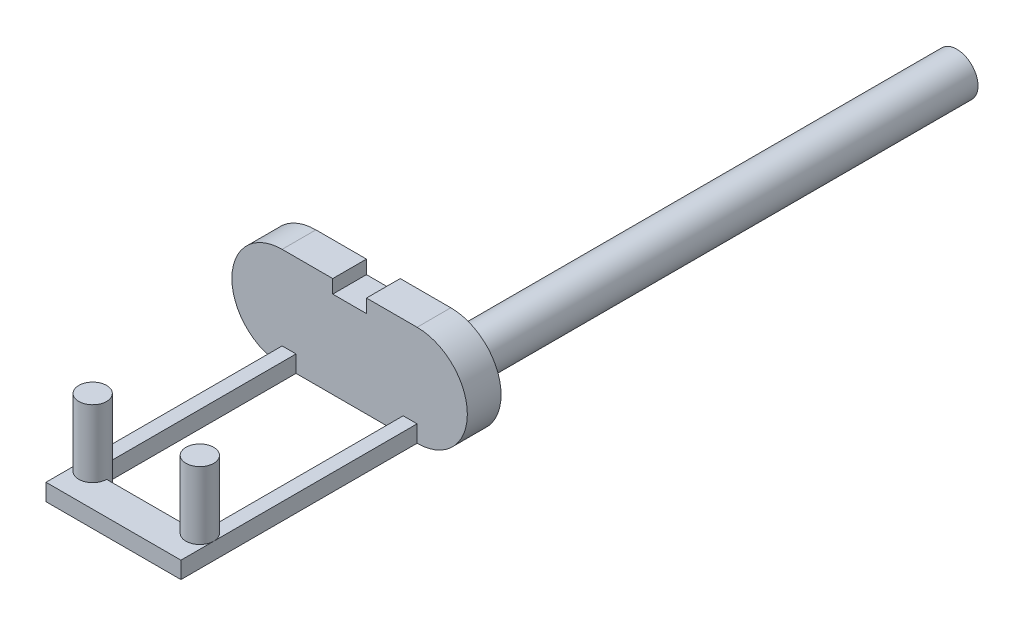
ISO-10303-21;
HEADER;
FILE_DESCRIPTION(('STEP AP214'),'2;1');
FILE_NAME('part.step','',(''),(''),'','','');
FILE_SCHEMA(('AUTOMOTIVE_DESIGN { 1 0 10303 214 1 1 1 1 }'));
ENDSEC;
DATA;
#1=APPLICATION_CONTEXT('core data for automotive mechanical design processes');
#2=APPLICATION_PROTOCOL_DEFINITION('international standard','automotive_design',2000,#1);
#3=PRODUCT_CONTEXT('',#1,'mechanical');
#4=PRODUCT('Part','Part','',(#3));
#5=PRODUCT_RELATED_PRODUCT_CATEGORY('part','',(#4));
#6=PRODUCT_DEFINITION_FORMATION('','',#4);
#7=PRODUCT_DEFINITION_CONTEXT('part definition',#1,'design');
#8=PRODUCT_DEFINITION('design','',#6,#7);
#9=PRODUCT_DEFINITION_SHAPE('','',#8);
#10=(LENGTH_UNIT() NAMED_UNIT(*) SI_UNIT(.MILLI.,.METRE.));
#11=(NAMED_UNIT(*) PLANE_ANGLE_UNIT() SI_UNIT($,.RADIAN.));
#12=(NAMED_UNIT(*) SI_UNIT($,.STERADIAN.) SOLID_ANGLE_UNIT());
#13=UNCERTAINTY_MEASURE_WITH_UNIT(LENGTH_MEASURE(1.E-05),#10,'distance_accuracy_value','');
#14=(GEOMETRIC_REPRESENTATION_CONTEXT(3) GLOBAL_UNCERTAINTY_ASSIGNED_CONTEXT((#13)) GLOBAL_UNIT_ASSIGNED_CONTEXT((#10,
#11,#12)) REPRESENTATION_CONTEXT('',''));
#15=CARTESIAN_POINT('',(0.,0.,0.));
#16=DIRECTION('',(0.,0.,1.));
#17=DIRECTION('',(1.,0.,0.));
#18=AXIS2_PLACEMENT_3D('',#15,#16,#17);
#19=CARTESIAN_POINT('',(-61.2640274636036,57.8352530805438,43.));
#20=DIRECTION('',(0.,-1.,0.));
#21=DIRECTION('',(0.,0.,-1.));
#22=AXIS2_PLACEMENT_3D('',#19,#20,#21);
#23=PLANE('',#22);
#24=DIRECTION('',(-1.,0.,0.));
#25=VECTOR('',#24,1.);
#26=CARTESIAN_POINT('',(-61.2640274636036,57.8352530805438,43.));
#27=LINE('',#26,#25);
#28=CARTESIAN_POINT('',(-73.7640274636036,57.8352530805438,43.));
#29=VERTEX_POINT('',#28);
#30=CARTESIAN_POINT('',(-81.2640274636036,57.8352530805438,43.));
#31=VERTEX_POINT('',#30);
#32=EDGE_CURVE('E154',#29,#31,#27,.T.);
#33=ORIENTED_EDGE('',*,*,#32,.F.);
#34=DIRECTION('',(0.,0.,1.));
#35=VECTOR('',#34,1.);
#36=CARTESIAN_POINT('',(-73.7640274636036,57.8352530805438,30.3857382714521));
#37=LINE('',#36,#35);
#38=CARTESIAN_POINT('',(-73.7640274636036,57.8352530805438,38.));
#39=VERTEX_POINT('',#38);
#40=EDGE_CURVE('E142',#39,#29,#37,.T.);
#41=ORIENTED_EDGE('',*,*,#40,.F.);
#42=DIRECTION('',(-1.,0.,0.));
#43=VECTOR('',#42,1.);
#44=CARTESIAN_POINT('',(-61.2640274636036,57.8352530805438,38.));
#45=LINE('',#44,#43);
#46=CARTESIAN_POINT('',(-81.2640274636036,57.8352530805438,38.));
#47=VERTEX_POINT('',#46);
#48=EDGE_CURVE('E152',#39,#47,#45,.T.);
#49=ORIENTED_EDGE('',*,*,#48,.T.);
#50=DIRECTION('',(0.,0.,-1.));
#51=VECTOR('',#50,1.);
#52=CARTESIAN_POINT('',(-81.2640274636036,57.8352530805438,43.));
#53=LINE('',#52,#51);
#54=EDGE_CURVE('E182',#31,#47,#53,.T.);
#55=ORIENTED_EDGE('',*,*,#54,.F.);
#56=EDGE_LOOP('',(#33,#41,#49,#55));
#57=FACE_BOUND('',#56,.T.);
#58=ADVANCED_FACE('F16',(#57),#23,.F.);
#59=CARTESIAN_POINT('',(0.,45.4390579258131,78.));
#60=DIRECTION('',(0.,1.,0.));
#61=DIRECTION('',(0.,0.,1.));
#62=AXIS2_PLACEMENT_3D('',#59,#60,#61);
#63=PLANE('',#62);
#64=CARTESIAN_POINT('',(-79.2048370431136,45.4390579258131,73.1394620866765));
#65=DIRECTION('',(0.,1.,0.));
#66=DIRECTION('',(0.,0.,1.));
#67=AXIS2_PLACEMENT_3D('',#64,#65,#66);
#68=CIRCLE('',#67,2.0591905457382);
#69=CARTESIAN_POINT('',(-79.2048370431136,45.4390579258131,71.0802715409383));
#70=VERTEX_POINT('',#69);
#71=CARTESIAN_POINT('',(-81.2640275888518,45.4390579258131,73.1394620866765));
#72=VERTEX_POINT('',#71);
#73=EDGE_CURVE('E314',#70,#72,#68,.T.);
#74=ORIENTED_EDGE('',*,*,#73,.F.);
#75=DIRECTION('',(0.,0.,-1.));
#76=VECTOR('',#75,1.);
#77=CARTESIAN_POINT('',(-79.2048370431136,45.4390579258131,78.));
#78=LINE('',#77,#76);
#79=CARTESIAN_POINT('',(-79.2048370431136,45.4390579258131,43.));
#80=VERTEX_POINT('',#79);
#81=EDGE_CURVE('E247',#70,#80,#78,.T.);
#82=ORIENTED_EDGE('',*,*,#81,.T.);
#83=DIRECTION('',(1.,0.,0.));
#84=VECTOR('',#83,1.);
#85=CARTESIAN_POINT('',(0.,45.4390579258131,43.));
#86=LINE('',#85,#84);
#87=CARTESIAN_POINT('',(-81.2640275888518,45.4390579258131,43.));
#88=VERTEX_POINT('',#87);
#89=EDGE_CURVE('E237',#88,#80,#86,.T.);
#90=ORIENTED_EDGE('',*,*,#89,.F.);
#91=DIRECTION('',(0.,0.,-1.));
#92=VECTOR('',#91,1.);
#93=CARTESIAN_POINT('',(-81.2640275888518,45.4390579258131,78.));
#94=LINE('',#93,#92);
#95=EDGE_CURVE('E232',#72,#88,#94,.T.);
#96=ORIENTED_EDGE('',*,*,#95,.F.);
#97=EDGE_LOOP('',(#74,#82,#90,#96));
#98=FACE_BOUND('',#97,.T.);
#99=ADVANCED_FACE('F318',(#98),#63,.T.);
#100=CARTESIAN_POINT('',(-63.3232178840935,45.4390579258131,73.1394620866765));
#101=DIRECTION('',(0.,1.,0.));
#102=DIRECTION('',(0.,0.,1.));
#103=AXIS2_PLACEMENT_3D('',#100,#101,#102);
#104=CIRCLE('',#103,2.05919054573816);
#105=CARTESIAN_POINT('',(-61.2640273383553,45.4390579258131,73.1394620866765));
#106=VERTEX_POINT('',#105);
#107=CARTESIAN_POINT('',(-63.3232178840935,45.4390579258131,71.0802715409384));
#108=VERTEX_POINT('',#107);
#109=EDGE_CURVE('E294',#106,#108,#104,.T.);
#110=ORIENTED_EDGE('',*,*,#109,.F.);
#111=DIRECTION('',(0.,0.,-1.));
#112=VECTOR('',#111,1.);
#113=CARTESIAN_POINT('',(-61.2640273383553,45.4390579258131,78.));
#114=LINE('',#113,#112);
#115=CARTESIAN_POINT('',(-61.2640273383553,45.4390579258131,43.));
#116=VERTEX_POINT('',#115);
#117=EDGE_CURVE('E269',#106,#116,#114,.T.);
#118=ORIENTED_EDGE('',*,*,#117,.T.);
#119=DIRECTION('',(1.,0.,0.));
#120=VECTOR('',#119,1.);
#121=CARTESIAN_POINT('',(0.,45.4390579258131,43.));
#122=LINE('',#121,#120);
#123=CARTESIAN_POINT('',(-63.3232178840935,45.4390579258131,43.));
#124=VERTEX_POINT('',#123);
#125=EDGE_CURVE('E255',#124,#116,#122,.T.);
#126=ORIENTED_EDGE('',*,*,#125,.F.);
#127=DIRECTION('',(0.,0.,-1.));
#128=VECTOR('',#127,1.);
#129=CARTESIAN_POINT('',(-63.3232178840935,45.4390579258131,78.));
#130=LINE('',#129,#128);
#131=EDGE_CURVE('E260',#108,#124,#130,.T.);
#132=ORIENTED_EDGE('',*,*,#131,.F.);
#133=EDGE_LOOP('',(#110,#118,#126,#132));
#134=FACE_BOUND('',#133,.T.);
#135=ADVANCED_FACE('F293',(#134),#63,.T.);
#136=CARTESIAN_POINT('',(-61.2640274636036,50.3871555031784,43.));
#137=DIRECTION('',(0.,0.,1.));
#138=DIRECTION('',(1.,0.,0.));
#139=AXIS2_PLACEMENT_3D('',#136,#137,#138);
#140=PLANE('',#139);
#141=DIRECTION('',(0.,-1.,0.));
#142=VECTOR('',#141,1.);
#143=CARTESIAN_POINT('',(-73.7640274636036,50.3871555031784,43.));
#144=LINE('',#143,#142);
#145=CARTESIAN_POINT('',(-73.7640274636036,55.8352530805438,43.));
#146=VERTEX_POINT('',#145);
#147=EDGE_CURVE('E342',#29,#146,#144,.T.);
#148=ORIENTED_EDGE('',*,*,#147,.F.);
#149=ORIENTED_EDGE('',*,*,#32,.T.);
#150=CARTESIAN_POINT('',(-81.2640274636036,50.3871555031784,43.));
#151=DIRECTION('',(0.,0.,1.));
#152=DIRECTION('',(1.,0.,0.));
#153=AXIS2_PLACEMENT_3D('',#150,#151,#152);
#154=CIRCLE('',#153,7.44809757736534);
#155=CARTESIAN_POINT('',(-81.2640274636036,42.9390579258131,43.));
#156=VERTEX_POINT('',#155);
#157=EDGE_CURVE('E223',#31,#156,#154,.T.);
#158=ORIENTED_EDGE('',*,*,#157,.T.);
#159=DIRECTION('',(0.,1.,0.));
#160=VECTOR('',#159,1.);
#161=CARTESIAN_POINT('',(-81.2640275888518,0.,43.));
#162=LINE('',#161,#160);
#163=EDGE_CURVE('E226',#156,#88,#162,.T.);
#164=ORIENTED_EDGE('',*,*,#163,.T.);
#165=ORIENTED_EDGE('',*,*,#89,.T.);
#166=DIRECTION('',(0.,1.,0.));
#167=VECTOR('',#166,1.);
#168=CARTESIAN_POINT('',(-79.2048370431136,0.,43.));
#169=LINE('',#168,#167);
#170=CARTESIAN_POINT('',(-79.2048370431136,42.9390579258131,43.));
#171=VERTEX_POINT('',#170);
#172=EDGE_CURVE('E240',#171,#80,#169,.T.);
#173=ORIENTED_EDGE('',*,*,#172,.F.);
#174=DIRECTION('',(1.,0.,0.));
#175=VECTOR('',#174,1.);
#176=CARTESIAN_POINT('',(-61.2640274636036,42.9390579258131,43.));
#177=LINE('',#176,#175);
#178=CARTESIAN_POINT('',(-63.3232178840935,42.9390579258131,43.));
#179=VERTEX_POINT('',#178);
#180=EDGE_CURVE('E179',#171,#179,#177,.T.);
#181=ORIENTED_EDGE('',*,*,#180,.T.);
#182=DIRECTION('',(0.,1.,0.));
#183=VECTOR('',#182,1.);
#184=CARTESIAN_POINT('',(-63.3232178840935,0.,43.));
#185=LINE('',#184,#183);
#186=EDGE_CURVE('E251',#179,#124,#185,.T.);
#187=ORIENTED_EDGE('',*,*,#186,.T.);
#188=ORIENTED_EDGE('',*,*,#125,.T.);
#189=DIRECTION('',(0.,1.,0.));
#190=VECTOR('',#189,1.);
#191=CARTESIAN_POINT('',(-61.2640273383553,0.,43.));
#192=LINE('',#191,#190);
#193=CARTESIAN_POINT('',(-61.2640274636036,42.9390579258131,43.));
#194=VERTEX_POINT('',#193);
#195=EDGE_CURVE('E263',#194,#116,#192,.T.);
#196=ORIENTED_EDGE('',*,*,#195,.F.);
#197=CARTESIAN_POINT('',(-61.2640274636036,50.3871555031784,43.));
#198=DIRECTION('',(0.,0.,1.));
#199=DIRECTION('',(1.,0.,0.));
#200=AXIS2_PLACEMENT_3D('',#197,#198,#199);
#201=CIRCLE('',#200,7.44809757736534);
#202=CARTESIAN_POINT('',(-61.2640274636036,57.8352530805438,43.));
#203=VERTEX_POINT('',#202);
#204=EDGE_CURVE('E174',#194,#203,#201,.T.);
#205=ORIENTED_EDGE('',*,*,#204,.T.);
#206=CARTESIAN_POINT('',(-68.7640274636036,57.8352530805438,43.));
#207=VERTEX_POINT('',#206);
#208=EDGE_CURVE('E206',#203,#207,#27,.T.);
#209=ORIENTED_EDGE('',*,*,#208,.T.);
#210=DIRECTION('',(0.,1.,0.));
#211=VECTOR('',#210,1.);
#212=CARTESIAN_POINT('',(-68.7640274636036,50.3871555031784,43.));
#213=LINE('',#212,#211);
#214=CARTESIAN_POINT('',(-68.7640274636036,55.8352530805438,43.));
#215=VERTEX_POINT('',#214);
#216=EDGE_CURVE('E344',#215,#207,#213,.T.);
#217=ORIENTED_EDGE('',*,*,#216,.F.);
#218=DIRECTION('',(1.,0.,0.));
#219=VECTOR('',#218,1.);
#220=CARTESIAN_POINT('',(-61.2640274636036,55.8352530805438,43.));
#221=LINE('',#220,#219);
#222=EDGE_CURVE('E346',#146,#215,#221,.T.);
#223=ORIENTED_EDGE('',*,*,#222,.F.);
#224=EDGE_LOOP('',(#148,#149,#158,#164,#165,#173,#181,#187,#188,#196,#205,#209,#217,#223));
#225=FACE_BOUND('',#224,.T.);
#226=ADVANCED_FACE('F282',(#225),#140,.T.);
#227=CARTESIAN_POINT('',(-61.2640274636036,50.3871555031784,38.));
#228=DIRECTION('',(0.,0.,-1.));
#229=DIRECTION('',(-1.,0.,0.));
#230=AXIS2_PLACEMENT_3D('',#227,#228,#229);
#231=CYLINDRICAL_SURFACE('',#230,3.13544056145611);
#232=CARTESIAN_POINT('',(-61.2640274636036,50.3871555031784,38.));
#233=DIRECTION('',(0.,0.,1.));
#234=DIRECTION('',(1.,0.,0.));
#235=AXIS2_PLACEMENT_3D('',#232,#233,#234);
#236=CIRCLE('',#235,3.13544056145611);
#237=CARTESIAN_POINT('',(-58.1285869021475,50.3871555031784,38.));
#238=VERTEX_POINT('',#237);
#239=EDGE_CURVE('E190',#238,#238,#236,.T.);
#240=ORIENTED_EDGE('',*,*,#239,.F.);
#241=EDGE_LOOP('',(#240));
#242=FACE_BOUND('',#241,.T.);
#243=CARTESIAN_POINT('',(-61.2640274636036,50.3871555031784,-37.));
#244=DIRECTION('',(0.,0.,1.));
#245=DIRECTION('',(1.,0.,0.));
#246=AXIS2_PLACEMENT_3D('',#243,#244,#245);
#247=CIRCLE('',#246,3.13544056145611);
#248=CARTESIAN_POINT('',(-58.1285869021475,50.3871555031784,-37.));
#249=VERTEX_POINT('',#248);
#250=EDGE_CURVE('E187',#249,#249,#247,.T.);
#251=ORIENTED_EDGE('',*,*,#250,.T.);
#252=EDGE_LOOP('',(#251));
#253=FACE_BOUND('',#252,.T.);
#254=ADVANCED_FACE('F18',(#242,#253),#231,.T.);
#255=CARTESIAN_POINT('',(-61.2640274636036,50.3871555031784,-37.));
#256=DIRECTION('',(0.,0.,1.));
#257=DIRECTION('',(1.,0.,0.));
#258=AXIS2_PLACEMENT_3D('',#255,#256,#257);
#259=PLANE('',#258);
#260=ORIENTED_EDGE('',*,*,#250,.F.);
#261=EDGE_LOOP('',(#260));
#262=FACE_BOUND('',#261,.T.);
#263=ADVANCED_FACE('F380',(#262),#259,.F.);
#264=CARTESIAN_POINT('',(-61.2640274636036,50.3871555031784,43.));
#265=DIRECTION('',(0.,0.,-1.));
#266=DIRECTION('',(-1.,0.,0.));
#267=AXIS2_PLACEMENT_3D('',#264,#265,#266);
#268=CYLINDRICAL_SURFACE('',#267,7.44809757736534);
#269=CARTESIAN_POINT('',(-61.2640274636036,50.3871555031784,38.));
#270=DIRECTION('',(0.,0.,1.));
#271=DIRECTION('',(1.,0.,0.));
#272=AXIS2_PLACEMENT_3D('',#269,#270,#271);
#273=CIRCLE('',#272,7.44809757736534);
#274=CARTESIAN_POINT('',(-61.2640274636036,42.9390579258131,38.));
#275=VERTEX_POINT('',#274);
#276=CARTESIAN_POINT('',(-61.2640274636036,57.8352530805438,38.));
#277=VERTEX_POINT('',#276);
#278=EDGE_CURVE('E163',#275,#277,#273,.T.);
#279=ORIENTED_EDGE('',*,*,#278,.T.);
#280=DIRECTION('',(0.,0.,-1.));
#281=VECTOR('',#280,1.);
#282=CARTESIAN_POINT('',(-61.2640274636036,57.8352530805438,43.));
#283=LINE('',#282,#281);
#284=EDGE_CURVE('E184',#203,#277,#283,.T.);
#285=ORIENTED_EDGE('',*,*,#284,.F.);
#286=ORIENTED_EDGE('',*,*,#204,.F.);
#287=DIRECTION('',(0.,0.,-1.));
#288=VECTOR('',#287,1.);
#289=CARTESIAN_POINT('',(-61.2640274636036,42.9390579258131,43.));
#290=LINE('',#289,#288);
#291=EDGE_CURVE('E175',#194,#275,#290,.T.);
#292=ORIENTED_EDGE('',*,*,#291,.T.);
#293=EDGE_LOOP('',(#279,#285,#286,#292));
#294=FACE_BOUND('',#293,.T.);
#295=ADVANCED_FACE('F210',(#294),#268,.T.);
#296=CARTESIAN_POINT('',(-68.7640274636036,57.8352530805438,38.));
#297=VERTEX_POINT('',#296);
#298=EDGE_CURVE('E162',#277,#297,#45,.T.);
#299=ORIENTED_EDGE('',*,*,#298,.T.);
#300=DIRECTION('',(0.,0.,-1.));
#301=VECTOR('',#300,1.);
#302=CARTESIAN_POINT('',(-68.7640274636036,57.8352530805438,30.3857382714521));
#303=LINE('',#302,#301);
#304=EDGE_CURVE('E155',#207,#297,#303,.T.);
#305=ORIENTED_EDGE('',*,*,#304,.F.);
#306=ORIENTED_EDGE('',*,*,#208,.F.);
#307=ORIENTED_EDGE('',*,*,#284,.T.);
#308=EDGE_LOOP('',(#299,#305,#306,#307));
#309=FACE_BOUND('',#308,.T.);
#310=ADVANCED_FACE('F203',(#309),#23,.F.);
#311=CARTESIAN_POINT('',(-81.2640274636036,50.3871555031784,43.));
#312=DIRECTION('',(0.,0.,-1.));
#313=DIRECTION('',(-1.,0.,0.));
#314=AXIS2_PLACEMENT_3D('',#311,#312,#313);
#315=CYLINDRICAL_SURFACE('',#314,7.44809757736534);
#316=CARTESIAN_POINT('',(-81.2640274636036,50.3871555031784,38.));
#317=DIRECTION('',(0.,0.,1.));
#318=DIRECTION('',(1.,0.,0.));
#319=AXIS2_PLACEMENT_3D('',#316,#317,#318);
#320=CIRCLE('',#319,7.44809757736534);
#321=CARTESIAN_POINT('',(-81.2640274636036,42.9390579258131,38.));
#322=VERTEX_POINT('',#321);
#323=EDGE_CURVE('E161',#47,#322,#320,.T.);
#324=ORIENTED_EDGE('',*,*,#323,.T.);
#325=DIRECTION('',(0.,0.,-1.));
#326=VECTOR('',#325,1.);
#327=CARTESIAN_POINT('',(-81.2640274636036,42.9390579258131,43.));
#328=LINE('',#327,#326);
#329=EDGE_CURVE('E178',#156,#322,#328,.T.);
#330=ORIENTED_EDGE('',*,*,#329,.F.);
#331=ORIENTED_EDGE('',*,*,#157,.F.);
#332=ORIENTED_EDGE('',*,*,#54,.T.);
#333=EDGE_LOOP('',(#324,#330,#331,#332));
#334=FACE_BOUND('',#333,.T.);
#335=ADVANCED_FACE('F222',(#334),#315,.T.);
#336=CARTESIAN_POINT('',(-61.2640274636036,42.9390579258131,43.));
#337=DIRECTION('',(0.,1.,0.));
#338=DIRECTION('',(0.,0.,1.));
#339=AXIS2_PLACEMENT_3D('',#336,#337,#338);
#340=PLANE('',#339);
#341=DIRECTION('',(0.,0.,-1.));
#342=VECTOR('',#341,1.);
#343=CARTESIAN_POINT('',(-81.2640274636036,42.9390579258131,78.));
#344=LINE('',#343,#342);
#345=CARTESIAN_POINT('',(-81.2640274636036,42.9390579258131,78.));
#346=VERTEX_POINT('',#345);
#347=EDGE_CURVE('E217',#346,#156,#344,.T.);
#348=ORIENTED_EDGE('',*,*,#347,.T.);
#349=ORIENTED_EDGE('',*,*,#329,.T.);
#350=DIRECTION('',(1.,0.,0.));
#351=VECTOR('',#350,1.);
#352=CARTESIAN_POINT('',(-61.2640274636036,42.9390579258131,38.));
#353=LINE('',#352,#351);
#354=EDGE_CURVE('E172',#322,#275,#353,.T.);
#355=ORIENTED_EDGE('',*,*,#354,.T.);
#356=ORIENTED_EDGE('',*,*,#291,.F.);
#357=DIRECTION('',(0.,0.,-1.));
#358=VECTOR('',#357,1.);
#359=CARTESIAN_POINT('',(-61.2640274636036,42.9390579258131,78.));
#360=LINE('',#359,#358);
#361=CARTESIAN_POINT('',(-61.2640274636036,42.9390579258131,78.));
#362=VERTEX_POINT('',#361);
#363=EDGE_CURVE('E273',#362,#194,#360,.T.);
#364=ORIENTED_EDGE('',*,*,#363,.F.);
#365=DIRECTION('',(1.,0.,0.));
#366=VECTOR('',#365,1.);
#367=CARTESIAN_POINT('',(0.,42.9390579258131,78.));
#368=LINE('',#367,#366);
#369=EDGE_CURVE('E252',#346,#362,#368,.T.);
#370=ORIENTED_EDGE('',*,*,#369,.F.);
#371=EDGE_LOOP('',(#348,#349,#355,#356,#364,#370));
#372=FACE_BOUND('',#371,.T.);
#373=DIRECTION('',(0.,0.,-1.));
#374=VECTOR('',#373,1.);
#375=CARTESIAN_POINT('',(-79.2048370431136,42.9390579258131,78.));
#376=LINE('',#375,#374);
#377=CARTESIAN_POINT('',(-79.2048370431136,42.9390579258131,71.0802715409383));
#378=VERTEX_POINT('',#377);
#379=EDGE_CURVE('E249',#378,#171,#376,.T.);
#380=ORIENTED_EDGE('',*,*,#379,.F.);
#381=CARTESIAN_POINT('',(-79.2048370431136,42.9390579258131,73.1394620866765));
#382=DIRECTION('',(0.,1.,0.));
#383=DIRECTION('',(0.,0.,1.));
#384=AXIS2_PLACEMENT_3D('',#381,#382,#383);
#385=CIRCLE('',#384,2.0591905457382);
#386=CARTESIAN_POINT('',(-77.1456464973754,42.9390579258131,73.1394620866765));
#387=VERTEX_POINT('',#386);
#388=EDGE_CURVE('E39',#378,#387,#385,.F.);
#389=ORIENTED_EDGE('',*,*,#388,.T.);
#390=DIRECTION('',(1.,0.,0.));
#391=VECTOR('',#390,1.);
#392=CARTESIAN_POINT('',(-61.2640273383553,42.9390579258131,73.1394620866765));
#393=LINE('',#392,#391);
#394=CARTESIAN_POINT('',(-65.3824084298317,42.9390579258131,73.1394620866765));
#395=VERTEX_POINT('',#394);
#396=EDGE_CURVE('E323',#387,#395,#393,.T.);
#397=ORIENTED_EDGE('',*,*,#396,.T.);
#398=CARTESIAN_POINT('',(-63.3232178840935,42.9390579258131,73.1394620866765));
#399=DIRECTION('',(0.,1.,0.));
#400=DIRECTION('',(0.,0.,1.));
#401=AXIS2_PLACEMENT_3D('',#398,#399,#400);
#402=CIRCLE('',#401,2.05919054573816);
#403=CARTESIAN_POINT('',(-63.3232178840935,42.9390579258131,71.0802715409384));
#404=VERTEX_POINT('',#403);
#405=EDGE_CURVE('E330',#395,#404,#402,.F.);
#406=ORIENTED_EDGE('',*,*,#405,.T.);
#407=DIRECTION('',(0.,0.,-1.));
#408=VECTOR('',#407,1.);
#409=CARTESIAN_POINT('',(-63.3232178840935,42.9390579258131,78.));
#410=LINE('',#409,#408);
#411=EDGE_CURVE('E167',#404,#179,#410,.T.);
#412=ORIENTED_EDGE('',*,*,#411,.T.);
#413=ORIENTED_EDGE('',*,*,#180,.F.);
#414=EDGE_LOOP('',(#380,#389,#397,#406,#412,#413));
#415=FACE_BOUND('',#414,.T.);
#416=ADVANCED_FACE('F213',(#372,#415),#340,.F.);
#417=CARTESIAN_POINT('',(-61.2640274636036,50.3871555031784,38.));
#418=DIRECTION('',(0.,0.,1.));
#419=DIRECTION('',(1.,0.,0.));
#420=AXIS2_PLACEMENT_3D('',#417,#418,#419);
#421=PLANE('',#420);
#422=ORIENTED_EDGE('',*,*,#48,.F.);
#423=DIRECTION('',(0.,-1.,0.));
#424=VECTOR('',#423,1.);
#425=CARTESIAN_POINT('',(-73.7640274636036,50.3871555031784,38.));
#426=LINE('',#425,#424);
#427=CARTESIAN_POINT('',(-73.7640274636036,55.8352530805438,38.));
#428=VERTEX_POINT('',#427);
#429=EDGE_CURVE('E11',#39,#428,#426,.T.);
#430=ORIENTED_EDGE('',*,*,#429,.T.);
#431=DIRECTION('',(1.,0.,0.));
#432=VECTOR('',#431,1.);
#433=CARTESIAN_POINT('',(-61.2640274636036,55.8352530805438,38.));
#434=LINE('',#433,#432);
#435=CARTESIAN_POINT('',(-68.7640274636036,55.8352530805438,38.));
#436=VERTEX_POINT('',#435);
#437=EDGE_CURVE('E197',#428,#436,#434,.T.);
#438=ORIENTED_EDGE('',*,*,#437,.T.);
#439=DIRECTION('',(0.,1.,0.));
#440=VECTOR('',#439,1.);
#441=CARTESIAN_POINT('',(-68.7640274636036,50.3871555031784,38.));
#442=LINE('',#441,#440);
#443=EDGE_CURVE('E24',#436,#297,#442,.T.);
#444=ORIENTED_EDGE('',*,*,#443,.T.);
#445=ORIENTED_EDGE('',*,*,#298,.F.);
#446=ORIENTED_EDGE('',*,*,#278,.F.);
#447=ORIENTED_EDGE('',*,*,#354,.F.);
#448=ORIENTED_EDGE('',*,*,#323,.F.);
#449=EDGE_LOOP('',(#422,#430,#438,#444,#445,#446,#447,#448));
#450=FACE_BOUND('',#449,.T.);
#451=ORIENTED_EDGE('',*,*,#239,.T.);
#452=EDGE_LOOP('',(#451));
#453=FACE_BOUND('',#452,.T.);
#454=ADVANCED_FACE('F158',(#450,#453),#421,.F.);
#455=CARTESIAN_POINT('',(-63.3232178840935,0.,78.));
#456=DIRECTION('',(-1.,0.,0.));
#457=DIRECTION('',(0.,0.,1.));
#458=AXIS2_PLACEMENT_3D('',#455,#456,#457);
#459=PLANE('',#458);
#460=DIRECTION('',(0.,1.,0.));
#461=VECTOR('',#460,1.);
#462=CARTESIAN_POINT('',(-63.3232178840935,37.1147875312263,71.0802715409384));
#463=LINE('',#462,#461);
#464=EDGE_CURVE('E290',#108,#404,#463,.F.);
#465=ORIENTED_EDGE('',*,*,#464,.F.);
#466=ORIENTED_EDGE('',*,*,#131,.T.);
#467=ORIENTED_EDGE('',*,*,#186,.F.);
#468=ORIENTED_EDGE('',*,*,#411,.F.);
#469=EDGE_LOOP('',(#465,#466,#467,#468));
#470=FACE_BOUND('',#469,.T.);
#471=ADVANCED_FACE('F288',(#470),#459,.T.);
#472=CARTESIAN_POINT('',(-61.2640273383553,0.,78.));
#473=DIRECTION('',(-1.,0.,0.));
#474=DIRECTION('',(0.,0.,1.));
#475=AXIS2_PLACEMENT_3D('',#472,#473,#474);
#476=PLANE('',#475);
#477=ORIENTED_EDGE('',*,*,#363,.T.);
#478=ORIENTED_EDGE('',*,*,#195,.T.);
#479=ORIENTED_EDGE('',*,*,#117,.F.);
#480=CARTESIAN_POINT('',(-61.2640273383553,45.4390579258131,78.));
#481=VERTEX_POINT('',#480);
#482=EDGE_CURVE('E270',#481,#106,#114,.T.);
#483=ORIENTED_EDGE('',*,*,#482,.F.);
#484=DIRECTION('',(0.,1.,0.));
#485=VECTOR('',#484,1.);
#486=CARTESIAN_POINT('',(-61.2640273383553,0.,78.));
#487=LINE('',#486,#485);
#488=EDGE_CURVE('E254',#362,#481,#487,.T.);
#489=ORIENTED_EDGE('',*,*,#488,.F.);
#490=EDGE_LOOP('',(#477,#478,#479,#483,#489));
#491=FACE_BOUND('',#490,.T.);
#492=ADVANCED_FACE('F298',(#491),#476,.F.);
#493=CARTESIAN_POINT('',(-77.1456464973754,45.4390579258131,73.1394620866765));
#494=VERTEX_POINT('',#493);
#495=EDGE_CURVE('E308',#72,#494,#68,.T.);
#496=ORIENTED_EDGE('',*,*,#495,.F.);
#497=CARTESIAN_POINT('',(-81.2640275888518,45.4390579258131,78.));
#498=VERTEX_POINT('',#497);
#499=EDGE_CURVE('E245',#498,#72,#94,.T.);
#500=ORIENTED_EDGE('',*,*,#499,.F.);
#501=DIRECTION('',(1.,0.,0.));
#502=VECTOR('',#501,1.);
#503=CARTESIAN_POINT('',(0.,45.4390579258131,78.));
#504=LINE('',#503,#502);
#505=EDGE_CURVE('E257',#498,#481,#504,.T.);
#506=ORIENTED_EDGE('',*,*,#505,.T.);
#507=ORIENTED_EDGE('',*,*,#482,.T.);
#508=CARTESIAN_POINT('',(-65.3824084298317,45.4390579258131,73.1394620866765));
#509=VERTEX_POINT('',#508);
#510=EDGE_CURVE('E328',#509,#106,#104,.T.);
#511=ORIENTED_EDGE('',*,*,#510,.F.);
#512=DIRECTION('',(-1.,0.,0.));
#513=VECTOR('',#512,1.);
#514=CARTESIAN_POINT('',(-61.2640273383553,45.4390579258131,73.1394620866765));
#515=LINE('',#514,#513);
#516=EDGE_CURVE('E311',#509,#494,#515,.T.);
#517=ORIENTED_EDGE('',*,*,#516,.T.);
#518=EDGE_LOOP('',(#496,#500,#506,#507,#511,#517));
#519=FACE_BOUND('',#518,.T.);
#520=ADVANCED_FACE('F306',(#519),#63,.T.);
#521=CARTESIAN_POINT('',(0.,0.,78.));
#522=DIRECTION('',(0.,0.,1.));
#523=DIRECTION('',(1.,0.,0.));
#524=AXIS2_PLACEMENT_3D('',#521,#522,#523);
#525=PLANE('',#524);
#526=ORIENTED_EDGE('',*,*,#505,.F.);
#527=DIRECTION('',(0.,1.,0.));
#528=VECTOR('',#527,1.);
#529=CARTESIAN_POINT('',(-81.2640275888518,0.,78.));
#530=LINE('',#529,#528);
#531=EDGE_CURVE('E236',#346,#498,#530,.T.);
#532=ORIENTED_EDGE('',*,*,#531,.F.);
#533=ORIENTED_EDGE('',*,*,#369,.T.);
#534=ORIENTED_EDGE('',*,*,#488,.T.);
#535=EDGE_LOOP('',(#526,#532,#533,#534));
#536=FACE_BOUND('',#535,.T.);
#537=ADVANCED_FACE('F302',(#536),#525,.T.);
#538=CARTESIAN_POINT('',(-79.2048370431136,0.,78.));
#539=DIRECTION('',(-1.,0.,0.));
#540=DIRECTION('',(0.,0.,1.));
#541=AXIS2_PLACEMENT_3D('',#538,#539,#540);
#542=PLANE('',#541);
#543=ORIENTED_EDGE('',*,*,#81,.F.);
#544=DIRECTION('',(0.,1.,0.));
#545=VECTOR('',#544,1.);
#546=CARTESIAN_POINT('',(-79.2048370431136,37.1147875312263,71.0802715409383));
#547=LINE('',#546,#545);
#548=EDGE_CURVE('E336',#70,#378,#547,.F.);
#549=ORIENTED_EDGE('',*,*,#548,.T.);
#550=ORIENTED_EDGE('',*,*,#379,.T.);
#551=ORIENTED_EDGE('',*,*,#172,.T.);
#552=EDGE_LOOP('',(#543,#549,#550,#551));
#553=FACE_BOUND('',#552,.T.);
#554=ADVANCED_FACE('F321',(#553),#542,.F.);
#555=CARTESIAN_POINT('',(-81.2640275888518,0.,78.));
#556=DIRECTION('',(-1.,0.,0.));
#557=DIRECTION('',(0.,0.,1.));
#558=AXIS2_PLACEMENT_3D('',#555,#556,#557);
#559=PLANE('',#558);
#560=ORIENTED_EDGE('',*,*,#499,.T.);
#561=ORIENTED_EDGE('',*,*,#95,.T.);
#562=ORIENTED_EDGE('',*,*,#163,.F.);
#563=ORIENTED_EDGE('',*,*,#347,.F.);
#564=ORIENTED_EDGE('',*,*,#531,.T.);
#565=EDGE_LOOP('',(#560,#561,#562,#563,#564));
#566=FACE_BOUND('',#565,.T.);
#567=ADVANCED_FACE('F228',(#566),#559,.T.);
#568=CARTESIAN_POINT('',(-61.2640273383553,22.356909378426,73.1394620866765));
#569=DIRECTION('',(0.,0.,-1.));
#570=DIRECTION('',(-1.,0.,0.));
#571=AXIS2_PLACEMENT_3D('',#568,#569,#570);
#572=PLANE('',#571);
#573=DIRECTION('',(0.,1.,0.));
#574=VECTOR('',#573,1.);
#575=CARTESIAN_POINT('',(-77.1456464973754,37.1147875312263,73.1394620866765));
#576=LINE('',#575,#574);
#577=EDGE_CURVE('E195',#494,#387,#576,.F.);
#578=ORIENTED_EDGE('',*,*,#577,.F.);
#579=ORIENTED_EDGE('',*,*,#516,.F.);
#580=DIRECTION('',(0.,1.,0.));
#581=VECTOR('',#580,1.);
#582=CARTESIAN_POINT('',(-65.3824084298317,37.1147875312263,73.1394620866765));
#583=LINE('',#582,#581);
#584=EDGE_CURVE('E193',#395,#509,#583,.T.);
#585=ORIENTED_EDGE('',*,*,#584,.F.);
#586=ORIENTED_EDGE('',*,*,#396,.F.);
#587=EDGE_LOOP('',(#578,#579,#585,#586));
#588=FACE_BOUND('',#587,.T.);
#589=ADVANCED_FACE('F418',(#588),#572,.T.);
#590=CARTESIAN_POINT('',(-63.3232178840935,37.1147875312263,73.1394620866765));
#591=DIRECTION('',(0.,1.,0.));
#592=DIRECTION('',(0.,0.,1.));
#593=AXIS2_PLACEMENT_3D('',#590,#591,#592);
#594=CYLINDRICAL_SURFACE('',#593,2.05919054573816);
#595=ORIENTED_EDGE('',*,*,#109,.T.);
#596=ORIENTED_EDGE('',*,*,#464,.T.);
#597=ORIENTED_EDGE('',*,*,#405,.F.);
#598=ORIENTED_EDGE('',*,*,#584,.T.);
#599=ORIENTED_EDGE('',*,*,#510,.T.);
#600=EDGE_LOOP('',(#595,#596,#597,#598,#599));
#601=FACE_BOUND('',#600,.T.);
#602=CARTESIAN_POINT('',(-63.3232178840935,55.4390579258131,73.1394620866765));
#603=DIRECTION('',(0.,1.,0.));
#604=DIRECTION('',(0.,0.,1.));
#605=AXIS2_PLACEMENT_3D('',#602,#603,#604);
#606=CIRCLE('',#605,2.05919054573816);
#607=CARTESIAN_POINT('',(-63.3232178840935,55.4390579258131,75.1986526324147));
#608=VERTEX_POINT('',#607);
#609=EDGE_CURVE('E333',#608,#608,#606,.T.);
#610=ORIENTED_EDGE('',*,*,#609,.F.);
#611=EDGE_LOOP('',(#610));
#612=FACE_BOUND('',#611,.T.);
#613=ADVANCED_FACE('F421',(#601,#612),#594,.T.);
#614=CARTESIAN_POINT('',(-63.3232178840935,55.4390579258131,73.1394620866765));
#615=DIRECTION('',(0.,1.,0.));
#616=DIRECTION('',(0.,0.,1.));
#617=AXIS2_PLACEMENT_3D('',#614,#615,#616);
#618=PLANE('',#617);
#619=ORIENTED_EDGE('',*,*,#609,.T.);
#620=EDGE_LOOP('',(#619));
#621=FACE_BOUND('',#620,.T.);
#622=ADVANCED_FACE('F425',(#621),#618,.T.);
#623=CARTESIAN_POINT('',(-79.2048370431136,37.1147875312263,73.1394620866765));
#624=DIRECTION('',(0.,1.,0.));
#625=DIRECTION('',(0.,0.,1.));
#626=AXIS2_PLACEMENT_3D('',#623,#624,#625);
#627=CYLINDRICAL_SURFACE('',#626,2.0591905457382);
#628=CARTESIAN_POINT('',(-79.2048370431136,55.4390579258131,73.1394620866765));
#629=DIRECTION('',(0.,1.,0.));
#630=DIRECTION('',(0.,0.,1.));
#631=AXIS2_PLACEMENT_3D('',#628,#629,#630);
#632=CIRCLE('',#631,2.0591905457382);
#633=CARTESIAN_POINT('',(-79.2048370431136,55.4390579258131,75.1986526324147));
#634=VERTEX_POINT('',#633);
#635=EDGE_CURVE('E339',#634,#634,#632,.T.);
#636=ORIENTED_EDGE('',*,*,#635,.F.);
#637=EDGE_LOOP('',(#636));
#638=FACE_BOUND('',#637,.T.);
#639=ORIENTED_EDGE('',*,*,#548,.F.);
#640=ORIENTED_EDGE('',*,*,#73,.T.);
#641=ORIENTED_EDGE('',*,*,#495,.T.);
#642=ORIENTED_EDGE('',*,*,#577,.T.);
#643=ORIENTED_EDGE('',*,*,#388,.F.);
#644=EDGE_LOOP('',(#639,#640,#641,#642,#643));
#645=FACE_BOUND('',#644,.T.);
#646=ADVANCED_FACE('F429',(#638,#645),#627,.T.);
#647=CARTESIAN_POINT('',(-79.2048370431136,55.4390579258131,73.1394620866765));
#648=DIRECTION('',(0.,1.,0.));
#649=DIRECTION('',(0.,0.,1.));
#650=AXIS2_PLACEMENT_3D('',#647,#648,#649);
#651=PLANE('',#650);
#652=ORIENTED_EDGE('',*,*,#635,.T.);
#653=EDGE_LOOP('',(#652));
#654=FACE_BOUND('',#653,.T.);
#655=ADVANCED_FACE('F363',(#654),#651,.T.);
#656=CARTESIAN_POINT('',(-73.7640274636036,55.8352530805438,30.3857382714521));
#657=DIRECTION('',(-1.,0.,0.));
#658=DIRECTION('',(0.,0.,1.));
#659=AXIS2_PLACEMENT_3D('',#656,#657,#658);
#660=PLANE('',#659);
#661=ORIENTED_EDGE('',*,*,#147,.T.);
#662=DIRECTION('',(0.,0.,1.));
#663=VECTOR('',#662,1.);
#664=CARTESIAN_POINT('',(-73.7640274636036,55.8352530805438,30.3857382714521));
#665=LINE('',#664,#663);
#666=EDGE_CURVE('E145',#428,#146,#665,.T.);
#667=ORIENTED_EDGE('',*,*,#666,.F.);
#668=ORIENTED_EDGE('',*,*,#429,.F.);
#669=ORIENTED_EDGE('',*,*,#40,.T.);
#670=EDGE_LOOP('',(#661,#667,#668,#669));
#671=FACE_BOUND('',#670,.T.);
#672=ADVANCED_FACE('F141',(#671),#660,.F.);
#673=CARTESIAN_POINT('',(-68.7640274636036,55.8352530805438,30.3857382714521));
#674=DIRECTION('',(1.,0.,0.));
#675=DIRECTION('',(0.,0.,-1.));
#676=AXIS2_PLACEMENT_3D('',#673,#674,#675);
#677=PLANE('',#676);
#678=ORIENTED_EDGE('',*,*,#216,.T.);
#679=ORIENTED_EDGE('',*,*,#304,.T.);
#680=ORIENTED_EDGE('',*,*,#443,.F.);
#681=DIRECTION('',(0.,0.,-1.));
#682=VECTOR('',#681,1.);
#683=CARTESIAN_POINT('',(-68.7640274636036,55.8352530805438,30.3857382714521));
#684=LINE('',#683,#682);
#685=EDGE_CURVE('E31',#215,#436,#684,.T.);
#686=ORIENTED_EDGE('',*,*,#685,.F.);
#687=EDGE_LOOP('',(#678,#679,#680,#686));
#688=FACE_BOUND('',#687,.T.);
#689=ADVANCED_FACE('F353',(#688),#677,.F.);
#690=CARTESIAN_POINT('',(0.,55.8352530805438,0.));
#691=DIRECTION('',(0.,-1.,0.));
#692=DIRECTION('',(0.,0.,-1.));
#693=AXIS2_PLACEMENT_3D('',#690,#691,#692);
#694=PLANE('',#693);
#695=ORIENTED_EDGE('',*,*,#222,.T.);
#696=ORIENTED_EDGE('',*,*,#685,.T.);
#697=ORIENTED_EDGE('',*,*,#437,.F.);
#698=ORIENTED_EDGE('',*,*,#666,.T.);
#699=EDGE_LOOP('',(#695,#696,#697,#698));
#700=FACE_BOUND('',#699,.T.);
#701=ADVANCED_FACE('F351',(#700),#694,.F.);
#702=CLOSED_SHELL('',(#58,#99,#135,#226,#254,#263,#295,#310,#335,#416,#454,#471,#492,#520,#537,
#554,#567,#589,#613,#622,#646,#655,#672,#689,#701));
#703=MANIFOLD_SOLID_BREP('B1',#702);
#704=ADVANCED_BREP_SHAPE_REPRESENTATION('',(#18,#703),#14);
#705=SHAPE_DEFINITION_REPRESENTATION(#9,#704);
ENDSEC;
END-ISO-10303-21;
